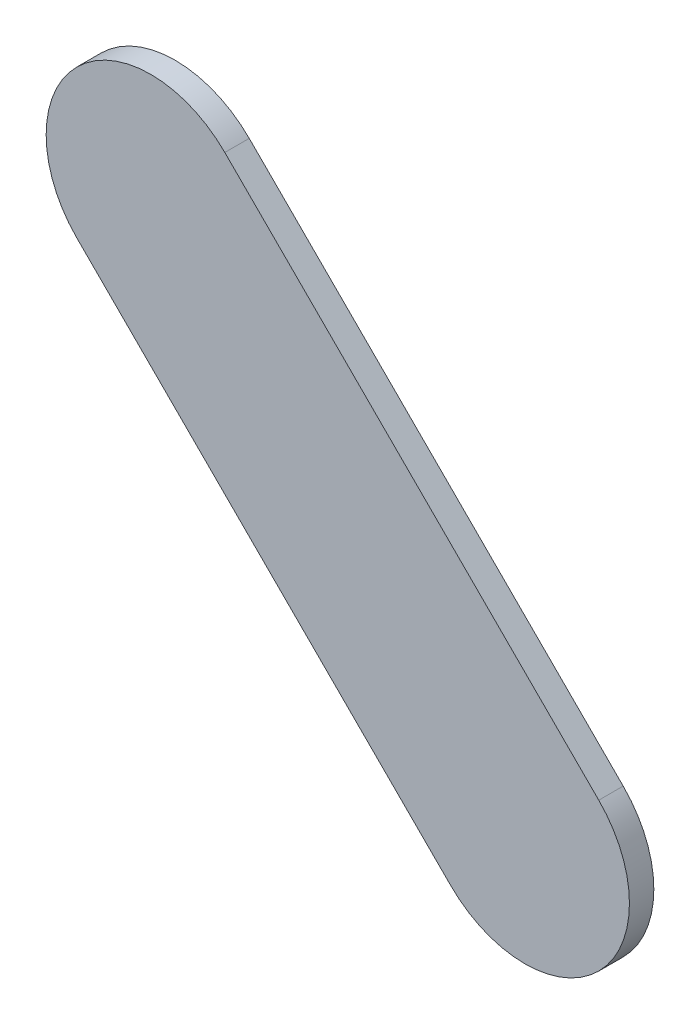
ISO-10303-21;
HEADER;
FILE_DESCRIPTION(('STEP AP214'),'2;1');
FILE_NAME('part.step','',(''),(''),'','','');
FILE_SCHEMA(('AUTOMOTIVE_DESIGN { 1 0 10303 214 1 1 1 1 }'));
ENDSEC;
DATA;
#1=APPLICATION_CONTEXT('core data for automotive mechanical design processes');
#2=APPLICATION_PROTOCOL_DEFINITION('international standard','automotive_design',2000,#1);
#3=PRODUCT_CONTEXT('',#1,'mechanical');
#4=PRODUCT('Part','Part','',(#3));
#5=PRODUCT_RELATED_PRODUCT_CATEGORY('part','',(#4));
#6=PRODUCT_DEFINITION_FORMATION('','',#4);
#7=PRODUCT_DEFINITION_CONTEXT('part definition',#1,'design');
#8=PRODUCT_DEFINITION('design','',#6,#7);
#9=PRODUCT_DEFINITION_SHAPE('','',#8);
#10=(LENGTH_UNIT() NAMED_UNIT(*) SI_UNIT(.MILLI.,.METRE.));
#11=(NAMED_UNIT(*) PLANE_ANGLE_UNIT() SI_UNIT($,.RADIAN.));
#12=(NAMED_UNIT(*) SI_UNIT($,.STERADIAN.) SOLID_ANGLE_UNIT());
#13=UNCERTAINTY_MEASURE_WITH_UNIT(LENGTH_MEASURE(1.E-05),#10,'distance_accuracy_value','');
#14=(GEOMETRIC_REPRESENTATION_CONTEXT(3) GLOBAL_UNCERTAINTY_ASSIGNED_CONTEXT((#13)) GLOBAL_UNIT_ASSIGNED_CONTEXT((#10,
#11,#12)) REPRESENTATION_CONTEXT('',''));
#15=CARTESIAN_POINT('',(0.,0.,0.));
#16=DIRECTION('',(0.,0.,1.));
#17=DIRECTION('',(1.,0.,0.));
#18=AXIS2_PLACEMENT_3D('',#15,#16,#17);
#19=CARTESIAN_POINT('',(137.236066,-108.573933,1.635));
#20=DIRECTION('',(0.,0.,1.));
#21=DIRECTION('',(1.,0.,0.));
#22=AXIS2_PLACEMENT_3D('',#19,#20,#21);
#23=PLANE('',#22);
#24=DIRECTION('',(-0.707106781186548,0.707106781186548,0.));
#25=VECTOR('',#24,1.);
#26=CARTESIAN_POINT('',(137.236066,-108.573933,1.635));
#27=LINE('',#26,#25);
#28=CARTESIAN_POINT('',(137.236066,-108.573933,1.635));
#29=VERTEX_POINT('',#28);
#30=CARTESIAN_POINT('',(136.700066,-108.037933,1.635));
#31=VERTEX_POINT('',#30);
#32=EDGE_CURVE('E81',#29,#31,#27,.T.);
#33=ORIENTED_EDGE('',*,*,#32,.T.);
#34=CARTESIAN_POINT('',(136.5939995,-108.1439995,1.635));
#35=DIRECTION('',(0.,0.,1.));
#36=DIRECTION('',(0.707106781186548,0.707106781186548,0.));
#37=AXIS2_PLACEMENT_3D('',#34,#35,#36);
#38=CIRCLE('',#37,0.150000682813);
#39=CARTESIAN_POINT('',(136.487933,-108.250066,1.635));
#40=VERTEX_POINT('',#39);
#41=EDGE_CURVE('E102',#31,#40,#38,.T.);
#42=ORIENTED_EDGE('',*,*,#41,.T.);
#43=DIRECTION('',(0.707106781186548,-0.707106781186548,0.));
#44=VECTOR('',#43,1.);
#45=CARTESIAN_POINT('',(136.487933,-108.250066,1.635));
#46=LINE('',#45,#44);
#47=CARTESIAN_POINT('',(137.023933,-108.786066,1.635));
#48=VERTEX_POINT('',#47);
#49=EDGE_CURVE('E73',#40,#48,#46,.T.);
#50=ORIENTED_EDGE('',*,*,#49,.T.);
#51=CARTESIAN_POINT('',(137.1299995,-108.6799995,1.635));
#52=DIRECTION('',(0.,0.,1.));
#53=DIRECTION('',(-0.707106781186548,-0.707106781186548,0.));
#54=AXIS2_PLACEMENT_3D('',#51,#52,#53);
#55=CIRCLE('',#54,0.150000682813);
#56=EDGE_CURVE('E11',#48,#29,#55,.T.);
#57=ORIENTED_EDGE('',*,*,#56,.T.);
#58=EDGE_LOOP('',(#33,#42,#50,#57));
#59=FACE_BOUND('',#58,.T.);
#60=ADVANCED_FACE('F17',(#59),#23,.T.);
#61=CARTESIAN_POINT('',(137.236066,-108.573933,1.6));
#62=DIRECTION('',(0.,0.,1.));
#63=DIRECTION('',(1.,0.,0.));
#64=AXIS2_PLACEMENT_3D('',#61,#62,#63);
#65=PLANE('',#64);
#66=CARTESIAN_POINT('',(137.1299995,-108.6799995,1.6));
#67=DIRECTION('',(0.,0.,1.));
#68=DIRECTION('',(-0.707106781186548,-0.707106781186548,0.));
#69=AXIS2_PLACEMENT_3D('',#66,#67,#68);
#70=CIRCLE('',#69,0.150000682813);
#71=CARTESIAN_POINT('',(137.023933,-108.786066,1.6));
#72=VERTEX_POINT('',#71);
#73=CARTESIAN_POINT('',(137.236066,-108.573933,1.6));
#74=VERTEX_POINT('',#73);
#75=EDGE_CURVE('E25',#72,#74,#70,.T.);
#76=ORIENTED_EDGE('',*,*,#75,.F.);
#77=DIRECTION('',(0.707106781186548,-0.707106781186548,0.));
#78=VECTOR('',#77,1.);
#79=CARTESIAN_POINT('',(136.487933,-108.250066,1.6));
#80=LINE('',#79,#78);
#81=CARTESIAN_POINT('',(136.487933,-108.250066,1.6));
#82=VERTEX_POINT('',#81);
#83=EDGE_CURVE('E106',#82,#72,#80,.T.);
#84=ORIENTED_EDGE('',*,*,#83,.F.);
#85=CARTESIAN_POINT('',(136.5939995,-108.1439995,1.6));
#86=DIRECTION('',(0.,0.,1.));
#87=DIRECTION('',(0.707106781186548,0.707106781186548,0.));
#88=AXIS2_PLACEMENT_3D('',#85,#86,#87);
#89=CIRCLE('',#88,0.150000682813);
#90=CARTESIAN_POINT('',(136.700066,-108.037933,1.6));
#91=VERTEX_POINT('',#90);
#92=EDGE_CURVE('E83',#91,#82,#89,.T.);
#93=ORIENTED_EDGE('',*,*,#92,.F.);
#94=DIRECTION('',(-0.707106781186548,0.707106781186548,0.));
#95=VECTOR('',#94,1.);
#96=CARTESIAN_POINT('',(137.236066,-108.573933,1.6));
#97=LINE('',#96,#95);
#98=EDGE_CURVE('E79',#74,#91,#97,.T.);
#99=ORIENTED_EDGE('',*,*,#98,.F.);
#100=EDGE_LOOP('',(#76,#84,#93,#99));
#101=FACE_BOUND('',#100,.T.);
#102=ADVANCED_FACE('F85',(#101),#65,.F.);
#103=CARTESIAN_POINT('',(137.1299995,-108.6799995,1.6));
#104=DIRECTION('',(0.,0.,-1.));
#105=DIRECTION('',(-0.707106781186548,-0.707106781186548,0.));
#106=AXIS2_PLACEMENT_3D('',#103,#104,#105);
#107=CYLINDRICAL_SURFACE('',#106,0.150000682813);
#108=ORIENTED_EDGE('',*,*,#75,.T.);
#109=DIRECTION('',(0.,0.,1.));
#110=VECTOR('',#109,1.);
#111=CARTESIAN_POINT('',(137.236066,-108.573933,1.6));
#112=LINE('',#111,#110);
#113=EDGE_CURVE('E67',#74,#29,#112,.T.);
#114=ORIENTED_EDGE('',*,*,#113,.T.);
#115=ORIENTED_EDGE('',*,*,#56,.F.);
#116=DIRECTION('',(0.,0.,1.));
#117=VECTOR('',#116,1.);
#118=CARTESIAN_POINT('',(137.023933,-108.786066,1.6));
#119=LINE('',#118,#117);
#120=EDGE_CURVE('E70',#72,#48,#119,.T.);
#121=ORIENTED_EDGE('',*,*,#120,.F.);
#122=EDGE_LOOP('',(#108,#114,#115,#121));
#123=FACE_BOUND('',#122,.T.);
#124=ADVANCED_FACE('F66',(#123),#107,.T.);
#125=CARTESIAN_POINT('',(136.487933,-108.250066,1.6));
#126=DIRECTION('',(0.707106781186548,0.707106781186548,0.));
#127=DIRECTION('',(0.,0.,-1.));
#128=AXIS2_PLACEMENT_3D('',#125,#126,#127);
#129=PLANE('',#128);
#130=ORIENTED_EDGE('',*,*,#83,.T.);
#131=ORIENTED_EDGE('',*,*,#120,.T.);
#132=ORIENTED_EDGE('',*,*,#49,.F.);
#133=DIRECTION('',(0.,0.,1.));
#134=VECTOR('',#133,1.);
#135=CARTESIAN_POINT('',(136.487933,-108.250066,1.6));
#136=LINE('',#135,#134);
#137=EDGE_CURVE('E101',#82,#40,#136,.T.);
#138=ORIENTED_EDGE('',*,*,#137,.F.);
#139=EDGE_LOOP('',(#130,#131,#132,#138));
#140=FACE_BOUND('',#139,.T.);
#141=ADVANCED_FACE('F119',(#140),#129,.F.);
#142=CARTESIAN_POINT('',(136.5939995,-108.1439995,1.6));
#143=DIRECTION('',(0.,0.,-1.));
#144=DIRECTION('',(0.707106781186548,0.707106781186548,0.));
#145=AXIS2_PLACEMENT_3D('',#142,#143,#144);
#146=CYLINDRICAL_SURFACE('',#145,0.150000682813);
#147=ORIENTED_EDGE('',*,*,#92,.T.);
#148=ORIENTED_EDGE('',*,*,#137,.T.);
#149=ORIENTED_EDGE('',*,*,#41,.F.);
#150=DIRECTION('',(0.,0.,1.));
#151=VECTOR('',#150,1.);
#152=CARTESIAN_POINT('',(136.700066,-108.037933,1.6));
#153=LINE('',#152,#151);
#154=EDGE_CURVE('E89',#91,#31,#153,.T.);
#155=ORIENTED_EDGE('',*,*,#154,.F.);
#156=EDGE_LOOP('',(#147,#148,#149,#155));
#157=FACE_BOUND('',#156,.T.);
#158=ADVANCED_FACE('F121',(#157),#146,.T.);
#159=CARTESIAN_POINT('',(137.236066,-108.573933,1.6));
#160=DIRECTION('',(-0.707106781186548,-0.707106781186548,0.));
#161=DIRECTION('',(-0.707106781186548,0.707106781186548,0.));
#162=AXIS2_PLACEMENT_3D('',#159,#160,#161);
#163=PLANE('',#162);
#164=ORIENTED_EDGE('',*,*,#98,.T.);
#165=ORIENTED_EDGE('',*,*,#154,.T.);
#166=ORIENTED_EDGE('',*,*,#32,.F.);
#167=ORIENTED_EDGE('',*,*,#113,.F.);
#168=EDGE_LOOP('',(#164,#165,#166,#167));
#169=FACE_BOUND('',#168,.T.);
#170=ADVANCED_FACE('F77',(#169),#163,.F.);
#171=CLOSED_SHELL('',(#60,#102,#124,#141,#158,#170));
#172=MANIFOLD_SOLID_BREP('B1',#171);
#173=ADVANCED_BREP_SHAPE_REPRESENTATION('',(#18,#172),#14);
#174=SHAPE_DEFINITION_REPRESENTATION(#9,#173);
ENDSEC;
END-ISO-10303-21;
